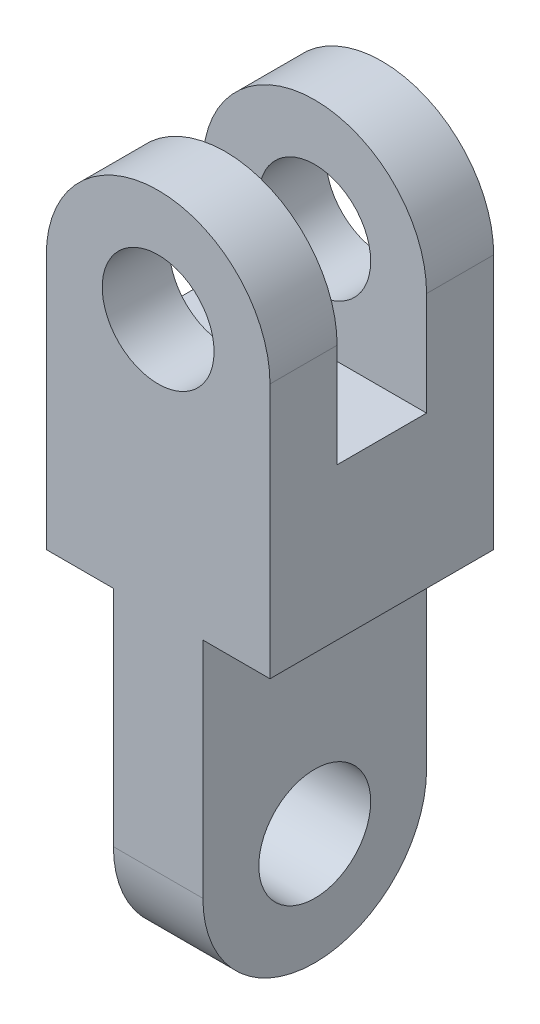
ISO-10303-21;
HEADER;
FILE_DESCRIPTION(('STEP AP214'),'2;1');
FILE_NAME('part.step','',(''),(''),'','','');
FILE_SCHEMA(('AUTOMOTIVE_DESIGN { 1 0 10303 214 1 1 1 1 }'));
ENDSEC;
DATA;
#1=APPLICATION_CONTEXT('core data for automotive mechanical design processes');
#2=APPLICATION_PROTOCOL_DEFINITION('international standard','automotive_design',2000,#1);
#3=PRODUCT_CONTEXT('',#1,'mechanical');
#4=PRODUCT('Part','Part','',(#3));
#5=PRODUCT_RELATED_PRODUCT_CATEGORY('part','',(#4));
#6=PRODUCT_DEFINITION_FORMATION('','',#4);
#7=PRODUCT_DEFINITION_CONTEXT('part definition',#1,'design');
#8=PRODUCT_DEFINITION('design','',#6,#7);
#9=PRODUCT_DEFINITION_SHAPE('','',#8);
#10=(LENGTH_UNIT() NAMED_UNIT(*) SI_UNIT(.MILLI.,.METRE.));
#11=(NAMED_UNIT(*) PLANE_ANGLE_UNIT() SI_UNIT($,.RADIAN.));
#12=(NAMED_UNIT(*) SI_UNIT($,.STERADIAN.) SOLID_ANGLE_UNIT());
#13=UNCERTAINTY_MEASURE_WITH_UNIT(LENGTH_MEASURE(1.E-05),#10,'distance_accuracy_value','');
#14=(GEOMETRIC_REPRESENTATION_CONTEXT(3) GLOBAL_UNCERTAINTY_ASSIGNED_CONTEXT((#13)) GLOBAL_UNIT_ASSIGNED_CONTEXT((#10,
#11,#12)) REPRESENTATION_CONTEXT('',''));
#15=CARTESIAN_POINT('',(0.,0.,0.));
#16=DIRECTION('',(0.,0.,1.));
#17=DIRECTION('',(1.,0.,0.));
#18=AXIS2_PLACEMENT_3D('',#15,#16,#17);
#19=CARTESIAN_POINT('',(0.,114.121621621621,-50.));
#20=DIRECTION('',(0.,0.,1.));
#21=DIRECTION('',(1.,0.,0.));
#22=AXIS2_PLACEMENT_3D('',#19,#20,#21);
#23=CYLINDRICAL_SURFACE('',#22,50.);
#24=CARTESIAN_POINT('',(0.,114.121621621621,-20.));
#25=DIRECTION('',(0.,0.,-1.));
#26=DIRECTION('',(-1.,0.,0.));
#27=AXIS2_PLACEMENT_3D('',#24,#25,#26);
#28=CIRCLE('',#27,50.);
#29=CARTESIAN_POINT('',(50.,114.121621621621,-20.));
#30=VERTEX_POINT('',#29);
#31=CARTESIAN_POINT('',(-50.,114.121621621621,-20.));
#32=VERTEX_POINT('',#31);
#33=EDGE_CURVE('E223',#30,#32,#28,.F.);
#34=ORIENTED_EDGE('',*,*,#33,.F.);
#35=DIRECTION('',(0.,0.,1.));
#36=VECTOR('',#35,1.);
#37=CARTESIAN_POINT('',(50.,114.121621621621,-50.));
#38=LINE('',#37,#36);
#39=CARTESIAN_POINT('',(50.,114.121621621621,-50.));
#40=VERTEX_POINT('',#39);
#41=EDGE_CURVE('E199',#40,#30,#38,.T.);
#42=ORIENTED_EDGE('',*,*,#41,.F.);
#43=CARTESIAN_POINT('',(0.,114.121621621621,-50.));
#44=DIRECTION('',(0.,0.,1.));
#45=DIRECTION('',(1.,0.,0.));
#46=AXIS2_PLACEMENT_3D('',#43,#44,#45);
#47=CIRCLE('',#46,50.);
#48=CARTESIAN_POINT('',(-50.,114.121621621621,-50.));
#49=VERTEX_POINT('',#48);
#50=EDGE_CURVE('E171',#40,#49,#47,.T.);
#51=ORIENTED_EDGE('',*,*,#50,.T.);
#52=DIRECTION('',(0.,0.,1.));
#53=VECTOR('',#52,1.);
#54=CARTESIAN_POINT('',(-50.,114.121621621621,-50.));
#55=LINE('',#54,#53);
#56=EDGE_CURVE('E194',#49,#32,#55,.T.);
#57=ORIENTED_EDGE('',*,*,#56,.T.);
#58=EDGE_LOOP('',(#34,#42,#51,#57));
#59=FACE_BOUND('',#58,.T.);
#60=ADVANCED_FACE('F39',(#59),#23,.T.);
#61=CARTESIAN_POINT('',(20.,-100.,-50.));
#62=DIRECTION('',(1.,0.,0.));
#63=DIRECTION('',(0.,0.,-1.));
#64=AXIS2_PLACEMENT_3D('',#61,#62,#63);
#65=PLANE('',#64);
#66=CARTESIAN_POINT('',(20.,-100.,0.));
#67=DIRECTION('',(1.,0.,0.));
#68=DIRECTION('',(0.,0.,-1.));
#69=AXIS2_PLACEMENT_3D('',#66,#67,#68);
#70=CIRCLE('',#69,25.);
#71=CARTESIAN_POINT('',(20.,-100.,-25.));
#72=VERTEX_POINT('',#71);
#73=EDGE_CURVE('E360',#72,#72,#70,.T.);
#74=ORIENTED_EDGE('',*,*,#73,.F.);
#75=EDGE_LOOP('',(#74));
#76=FACE_BOUND('',#75,.T.);
#77=DIRECTION('',(0.,0.,1.));
#78=VECTOR('',#77,1.);
#79=CARTESIAN_POINT('',(20.,0.,-50.));
#80=LINE('',#79,#78);
#81=CARTESIAN_POINT('',(20.,0.,-50.));
#82=VERTEX_POINT('',#81);
#83=CARTESIAN_POINT('',(20.,0.,50.));
#84=VERTEX_POINT('',#83);
#85=EDGE_CURVE('E188',#82,#84,#80,.T.);
#86=ORIENTED_EDGE('',*,*,#85,.T.);
#87=DIRECTION('',(0.,1.,0.));
#88=VECTOR('',#87,1.);
#89=CARTESIAN_POINT('',(20.,-100.,50.));
#90=LINE('',#89,#88);
#91=CARTESIAN_POINT('',(20.,-100.,50.));
#92=VERTEX_POINT('',#91);
#93=EDGE_CURVE('E210',#92,#84,#90,.T.);
#94=ORIENTED_EDGE('',*,*,#93,.F.);
#95=CARTESIAN_POINT('',(20.,-100.,0.));
#96=DIRECTION('',(-1.,0.,0.));
#97=DIRECTION('',(0.,0.,1.));
#98=AXIS2_PLACEMENT_3D('',#95,#96,#97);
#99=CIRCLE('',#98,50.);
#100=CARTESIAN_POINT('',(20.,-99.9999999999991,-50.));
#101=VERTEX_POINT('',#100);
#102=EDGE_CURVE('E136',#101,#92,#99,.T.);
#103=ORIENTED_EDGE('',*,*,#102,.F.);
#104=DIRECTION('',(0.,1.,0.));
#105=VECTOR('',#104,1.);
#106=CARTESIAN_POINT('',(20.,-100.,-50.));
#107=LINE('',#106,#105);
#108=EDGE_CURVE('E146',#101,#82,#107,.T.);
#109=ORIENTED_EDGE('',*,*,#108,.T.);
#110=EDGE_LOOP('',(#86,#94,#103,#109));
#111=FACE_BOUND('',#110,.T.);
#112=ADVANCED_FACE('F41',(#76,#111),#65,.T.);
#113=CARTESIAN_POINT('',(-20.,0.,-50.));
#114=DIRECTION('',(-1.,0.,0.));
#115=DIRECTION('',(0.,-1.,0.));
#116=AXIS2_PLACEMENT_3D('',#113,#114,#115);
#117=PLANE('',#116);
#118=CARTESIAN_POINT('',(-20.,-100.,0.));
#119=DIRECTION('',(-1.,0.,0.));
#120=DIRECTION('',(0.,-1.,0.));
#121=AXIS2_PLACEMENT_3D('',#118,#119,#120);
#122=CIRCLE('',#121,25.);
#123=CARTESIAN_POINT('',(-20.,-125.,0.));
#124=VERTEX_POINT('',#123);
#125=EDGE_CURVE('E137',#124,#124,#122,.T.);
#126=ORIENTED_EDGE('',*,*,#125,.F.);
#127=EDGE_LOOP('',(#126));
#128=FACE_BOUND('',#127,.T.);
#129=DIRECTION('',(0.,-1.,0.));
#130=VECTOR('',#129,1.);
#131=CARTESIAN_POINT('',(-20.,0.,-50.));
#132=LINE('',#131,#130);
#133=CARTESIAN_POINT('',(-20.,0.,-50.));
#134=VERTEX_POINT('',#133);
#135=CARTESIAN_POINT('',(-20.,-99.9999999999991,-50.));
#136=VERTEX_POINT('',#135);
#137=EDGE_CURVE('E131',#134,#136,#132,.T.);
#138=ORIENTED_EDGE('',*,*,#137,.T.);
#139=CARTESIAN_POINT('',(-20.,-100.,0.));
#140=DIRECTION('',(-1.,0.,0.));
#141=DIRECTION('',(0.,0.,1.));
#142=AXIS2_PLACEMENT_3D('',#139,#140,#141);
#143=CIRCLE('',#142,50.);
#144=CARTESIAN_POINT('',(-20.,-100.,50.));
#145=VERTEX_POINT('',#144);
#146=EDGE_CURVE('E126',#136,#145,#143,.T.);
#147=ORIENTED_EDGE('',*,*,#146,.T.);
#148=DIRECTION('',(0.,-1.,0.));
#149=VECTOR('',#148,1.);
#150=CARTESIAN_POINT('',(-20.,0.,50.));
#151=LINE('',#150,#149);
#152=CARTESIAN_POINT('',(-20.,0.,50.));
#153=VERTEX_POINT('',#152);
#154=EDGE_CURVE('E130',#153,#145,#151,.T.);
#155=ORIENTED_EDGE('',*,*,#154,.F.);
#156=DIRECTION('',(0.,0.,1.));
#157=VECTOR('',#156,1.);
#158=CARTESIAN_POINT('',(-20.,0.,-50.));
#159=LINE('',#158,#157);
#160=EDGE_CURVE('E49',#134,#153,#159,.T.);
#161=ORIENTED_EDGE('',*,*,#160,.F.);
#162=EDGE_LOOP('',(#138,#147,#155,#161));
#163=FACE_BOUND('',#162,.T.);
#164=ADVANCED_FACE('F128',(#128,#163),#117,.T.);
#165=CARTESIAN_POINT('',(-50.,0.,-50.));
#166=DIRECTION('',(0.,-1.,0.));
#167=DIRECTION('',(0.,0.,-1.));
#168=AXIS2_PLACEMENT_3D('',#165,#166,#167);
#169=PLANE('',#168);
#170=ORIENTED_EDGE('',*,*,#160,.T.);
#171=DIRECTION('',(1.,0.,0.));
#172=VECTOR('',#171,1.);
#173=CARTESIAN_POINT('',(-50.,0.,50.));
#174=LINE('',#173,#172);
#175=CARTESIAN_POINT('',(-50.,0.,50.));
#176=VERTEX_POINT('',#175);
#177=EDGE_CURVE('E152',#176,#153,#174,.T.);
#178=ORIENTED_EDGE('',*,*,#177,.F.);
#179=DIRECTION('',(0.,0.,1.));
#180=VECTOR('',#179,1.);
#181=CARTESIAN_POINT('',(-50.,0.,-50.));
#182=LINE('',#181,#180);
#183=CARTESIAN_POINT('',(-50.,0.,-50.));
#184=VERTEX_POINT('',#183);
#185=EDGE_CURVE('E191',#184,#176,#182,.T.);
#186=ORIENTED_EDGE('',*,*,#185,.F.);
#187=DIRECTION('',(1.,0.,0.));
#188=VECTOR('',#187,1.);
#189=CARTESIAN_POINT('',(-50.,0.,-50.));
#190=LINE('',#189,#188);
#191=EDGE_CURVE('E179',#184,#134,#190,.T.);
#192=ORIENTED_EDGE('',*,*,#191,.T.);
#193=EDGE_LOOP('',(#170,#178,#186,#192));
#194=FACE_BOUND('',#193,.T.);
#195=ADVANCED_FACE('F240',(#194),#169,.T.);
#196=CARTESIAN_POINT('',(-50.,114.121621621621,-50.));
#197=DIRECTION('',(-1.,0.,0.));
#198=DIRECTION('',(0.,-1.,0.));
#199=AXIS2_PLACEMENT_3D('',#196,#197,#198);
#200=PLANE('',#199);
#201=DIRECTION('',(0.,1.,0.));
#202=VECTOR('',#201,1.);
#203=CARTESIAN_POINT('',(-50.,67.8478847164321,-20.));
#204=LINE('',#203,#202);
#205=CARTESIAN_POINT('',(-50.,67.8478847164321,-20.));
#206=VERTEX_POINT('',#205);
#207=EDGE_CURVE('E250',#206,#32,#204,.T.);
#208=ORIENTED_EDGE('',*,*,#207,.T.);
#209=ORIENTED_EDGE('',*,*,#56,.F.);
#210=DIRECTION('',(0.,-1.,0.));
#211=VECTOR('',#210,1.);
#212=CARTESIAN_POINT('',(-50.,114.121621621621,-50.));
#213=LINE('',#212,#211);
#214=EDGE_CURVE('E175',#49,#184,#213,.T.);
#215=ORIENTED_EDGE('',*,*,#214,.T.);
#216=ORIENTED_EDGE('',*,*,#185,.T.);
#217=DIRECTION('',(0.,-1.,0.));
#218=VECTOR('',#217,1.);
#219=CARTESIAN_POINT('',(-50.,114.121621621621,50.));
#220=LINE('',#219,#218);
#221=CARTESIAN_POINT('',(-50.,114.121621621621,50.));
#222=VERTEX_POINT('',#221);
#223=EDGE_CURVE('E156',#222,#176,#220,.T.);
#224=ORIENTED_EDGE('',*,*,#223,.F.);
#225=CARTESIAN_POINT('',(-50.,114.121621621621,20.));
#226=VERTEX_POINT('',#225);
#227=EDGE_CURVE('E198',#226,#222,#55,.T.);
#228=ORIENTED_EDGE('',*,*,#227,.F.);
#229=DIRECTION('',(0.,-1.,0.));
#230=VECTOR('',#229,1.);
#231=CARTESIAN_POINT('',(-50.,168.662891807038,20.));
#232=LINE('',#231,#230);
#233=CARTESIAN_POINT('',(-50.,67.8478847164321,20.));
#234=VERTEX_POINT('',#233);
#235=EDGE_CURVE('E263',#226,#234,#232,.T.);
#236=ORIENTED_EDGE('',*,*,#235,.T.);
#237=DIRECTION('',(0.,0.,-1.));
#238=VECTOR('',#237,1.);
#239=CARTESIAN_POINT('',(-50.,67.8478847164321,20.));
#240=LINE('',#239,#238);
#241=EDGE_CURVE('E265',#234,#206,#240,.T.);
#242=ORIENTED_EDGE('',*,*,#241,.T.);
#243=EDGE_LOOP('',(#208,#209,#215,#216,#224,#228,#236,#242));
#244=FACE_BOUND('',#243,.T.);
#245=ADVANCED_FACE('F247',(#244),#200,.T.);
#246=CARTESIAN_POINT('',(0.,114.121621621621,20.));
#247=DIRECTION('',(0.,0.,1.));
#248=DIRECTION('',(0.,-1.,0.));
#249=AXIS2_PLACEMENT_3D('',#246,#247,#248);
#250=CIRCLE('',#249,50.);
#251=CARTESIAN_POINT('',(50.,114.121621621621,20.));
#252=VERTEX_POINT('',#251);
#253=EDGE_CURVE('E55',#226,#252,#250,.F.);
#254=ORIENTED_EDGE('',*,*,#253,.F.);
#255=ORIENTED_EDGE('',*,*,#227,.T.);
#256=CARTESIAN_POINT('',(0.,114.121621621621,50.));
#257=DIRECTION('',(0.,0.,1.));
#258=DIRECTION('',(1.,0.,0.));
#259=AXIS2_PLACEMENT_3D('',#256,#257,#258);
#260=CIRCLE('',#259,50.);
#261=CARTESIAN_POINT('',(50.,114.121621621621,50.));
#262=VERTEX_POINT('',#261);
#263=EDGE_CURVE('E231',#262,#222,#260,.T.);
#264=ORIENTED_EDGE('',*,*,#263,.F.);
#265=EDGE_CURVE('E203',#252,#262,#38,.T.);
#266=ORIENTED_EDGE('',*,*,#265,.F.);
#267=EDGE_LOOP('',(#254,#255,#264,#266));
#268=FACE_BOUND('',#267,.T.);
#269=ADVANCED_FACE('F259',(#268),#23,.T.);
#270=CARTESIAN_POINT('',(50.,0.,-50.));
#271=DIRECTION('',(1.,0.,0.));
#272=DIRECTION('',(0.,1.,0.));
#273=AXIS2_PLACEMENT_3D('',#270,#271,#272);
#274=PLANE('',#273);
#275=DIRECTION('',(0.,1.,0.));
#276=VECTOR('',#275,1.);
#277=CARTESIAN_POINT('',(50.,67.8478847164321,-20.));
#278=LINE('',#277,#276);
#279=CARTESIAN_POINT('',(50.,67.8478847164321,-20.));
#280=VERTEX_POINT('',#279);
#281=EDGE_CURVE('E267',#280,#30,#278,.T.);
#282=ORIENTED_EDGE('',*,*,#281,.F.);
#283=DIRECTION('',(0.,0.,-1.));
#284=VECTOR('',#283,1.);
#285=CARTESIAN_POINT('',(50.,67.8478847164321,20.));
#286=LINE('',#285,#284);
#287=CARTESIAN_POINT('',(50.,67.8478847164321,20.));
#288=VERTEX_POINT('',#287);
#289=EDGE_CURVE('E272',#288,#280,#286,.T.);
#290=ORIENTED_EDGE('',*,*,#289,.F.);
#291=DIRECTION('',(0.,-1.,0.));
#292=VECTOR('',#291,1.);
#293=CARTESIAN_POINT('',(50.,0.,20.));
#294=LINE('',#293,#292);
#295=EDGE_CURVE('E11',#252,#288,#294,.T.);
#296=ORIENTED_EDGE('',*,*,#295,.F.);
#297=ORIENTED_EDGE('',*,*,#265,.T.);
#298=DIRECTION('',(0.,1.,0.));
#299=VECTOR('',#298,1.);
#300=CARTESIAN_POINT('',(50.,0.,50.));
#301=LINE('',#300,#299);
#302=CARTESIAN_POINT('',(50.,0.,50.));
#303=VERTEX_POINT('',#302);
#304=EDGE_CURVE('E220',#303,#262,#301,.T.);
#305=ORIENTED_EDGE('',*,*,#304,.F.);
#306=DIRECTION('',(0.,0.,1.));
#307=VECTOR('',#306,1.);
#308=CARTESIAN_POINT('',(50.,0.,-50.));
#309=LINE('',#308,#307);
#310=CARTESIAN_POINT('',(50.,0.,-50.));
#311=VERTEX_POINT('',#310);
#312=EDGE_CURVE('E204',#311,#303,#309,.T.);
#313=ORIENTED_EDGE('',*,*,#312,.F.);
#314=DIRECTION('',(0.,1.,0.));
#315=VECTOR('',#314,1.);
#316=CARTESIAN_POINT('',(50.,0.,-50.));
#317=LINE('',#316,#315);
#318=EDGE_CURVE('E167',#311,#40,#317,.T.);
#319=ORIENTED_EDGE('',*,*,#318,.T.);
#320=ORIENTED_EDGE('',*,*,#41,.T.);
#321=EDGE_LOOP('',(#282,#290,#296,#297,#305,#313,#319,#320));
#322=FACE_BOUND('',#321,.T.);
#323=ADVANCED_FACE('F256',(#322),#274,.T.);
#324=CARTESIAN_POINT('',(20.,0.,-50.));
#325=DIRECTION('',(0.,-1.,0.));
#326=DIRECTION('',(0.,0.,-1.));
#327=AXIS2_PLACEMENT_3D('',#324,#325,#326);
#328=PLANE('',#327);
#329=ORIENTED_EDGE('',*,*,#312,.T.);
#330=DIRECTION('',(1.,0.,0.));
#331=VECTOR('',#330,1.);
#332=CARTESIAN_POINT('',(20.,0.,50.));
#333=LINE('',#332,#331);
#334=EDGE_CURVE('E215',#84,#303,#333,.T.);
#335=ORIENTED_EDGE('',*,*,#334,.F.);
#336=ORIENTED_EDGE('',*,*,#85,.F.);
#337=DIRECTION('',(1.,0.,0.));
#338=VECTOR('',#337,1.);
#339=CARTESIAN_POINT('',(20.,0.,-50.));
#340=LINE('',#339,#338);
#341=EDGE_CURVE('E163',#82,#311,#340,.T.);
#342=ORIENTED_EDGE('',*,*,#341,.T.);
#343=EDGE_LOOP('',(#329,#335,#336,#342));
#344=FACE_BOUND('',#343,.T.);
#345=ADVANCED_FACE('F216',(#344),#328,.T.);
#346=CARTESIAN_POINT('',(0.,114.121621621621,-50.));
#347=DIRECTION('',(0.,0.,1.));
#348=DIRECTION('',(1.,0.,0.));
#349=AXIS2_PLACEMENT_3D('',#346,#347,#348);
#350=PLANE('',#349);
#351=CARTESIAN_POINT('',(0.,114.121621621621,-50.));
#352=DIRECTION('',(0.,0.,1.));
#353=DIRECTION('',(1.,0.,0.));
#354=AXIS2_PLACEMENT_3D('',#351,#352,#353);
#355=CIRCLE('',#354,25.);
#356=CARTESIAN_POINT('',(25.,114.121621621621,-50.));
#357=VERTEX_POINT('',#356);
#358=EDGE_CURVE('E345',#357,#357,#355,.T.);
#359=ORIENTED_EDGE('',*,*,#358,.T.);
#360=EDGE_LOOP('',(#359));
#361=FACE_BOUND('',#360,.T.);
#362=ORIENTED_EDGE('',*,*,#108,.F.);
#363=DIRECTION('',(1.,0.,0.));
#364=VECTOR('',#363,1.);
#365=CARTESIAN_POINT('',(-20.,-100.,-50.));
#366=LINE('',#365,#364);
#367=EDGE_CURVE('E185',#136,#101,#366,.T.);
#368=ORIENTED_EDGE('',*,*,#367,.F.);
#369=ORIENTED_EDGE('',*,*,#137,.F.);
#370=ORIENTED_EDGE('',*,*,#191,.F.);
#371=ORIENTED_EDGE('',*,*,#214,.F.);
#372=ORIENTED_EDGE('',*,*,#50,.F.);
#373=ORIENTED_EDGE('',*,*,#318,.F.);
#374=ORIENTED_EDGE('',*,*,#341,.F.);
#375=EDGE_LOOP('',(#362,#368,#369,#370,#371,#372,#373,#374));
#376=FACE_BOUND('',#375,.T.);
#377=ADVANCED_FACE('F244',(#361,#376),#350,.F.);
#378=CARTESIAN_POINT('',(0.,114.121621621621,50.));
#379=DIRECTION('',(0.,0.,1.));
#380=DIRECTION('',(1.,0.,0.));
#381=AXIS2_PLACEMENT_3D('',#378,#379,#380);
#382=PLANE('',#381);
#383=CARTESIAN_POINT('',(0.,114.121621621621,50.));
#384=DIRECTION('',(0.,0.,1.));
#385=DIRECTION('',(1.,0.,0.));
#386=AXIS2_PLACEMENT_3D('',#383,#384,#385);
#387=CIRCLE('',#386,25.);
#388=CARTESIAN_POINT('',(25.,114.121621621621,50.));
#389=VERTEX_POINT('',#388);
#390=EDGE_CURVE('E349',#389,#389,#387,.T.);
#391=ORIENTED_EDGE('',*,*,#390,.F.);
#392=EDGE_LOOP('',(#391));
#393=FACE_BOUND('',#392,.T.);
#394=ORIENTED_EDGE('',*,*,#93,.T.);
#395=ORIENTED_EDGE('',*,*,#334,.T.);
#396=ORIENTED_EDGE('',*,*,#304,.T.);
#397=ORIENTED_EDGE('',*,*,#263,.T.);
#398=ORIENTED_EDGE('',*,*,#223,.T.);
#399=ORIENTED_EDGE('',*,*,#177,.T.);
#400=ORIENTED_EDGE('',*,*,#154,.T.);
#401=DIRECTION('',(1.,0.,0.));
#402=VECTOR('',#401,1.);
#403=CARTESIAN_POINT('',(-20.,-100.,50.));
#404=LINE('',#403,#402);
#405=EDGE_CURVE('E140',#145,#92,#404,.T.);
#406=ORIENTED_EDGE('',*,*,#405,.T.);
#407=EDGE_LOOP('',(#394,#395,#396,#397,#398,#399,#400,#406));
#408=FACE_BOUND('',#407,.T.);
#409=ADVANCED_FACE('F149',(#393,#408),#382,.T.);
#410=CARTESIAN_POINT('',(-50.,67.8478847164321,-20.));
#411=DIRECTION('',(0.,0.,-1.));
#412=DIRECTION('',(-1.,0.,0.));
#413=AXIS2_PLACEMENT_3D('',#410,#411,#412);
#414=PLANE('',#413);
#415=CARTESIAN_POINT('',(0.,114.121621621621,-20.));
#416=DIRECTION('',(0.,0.,-1.));
#417=DIRECTION('',(-1.,0.,0.));
#418=AXIS2_PLACEMENT_3D('',#415,#416,#417);
#419=CIRCLE('',#418,25.);
#420=CARTESIAN_POINT('',(-25.,114.121621621621,-20.));
#421=VERTEX_POINT('',#420);
#422=EDGE_CURVE('E43',#421,#421,#419,.T.);
#423=ORIENTED_EDGE('',*,*,#422,.T.);
#424=EDGE_LOOP('',(#423));
#425=FACE_BOUND('',#424,.T.);
#426=ORIENTED_EDGE('',*,*,#33,.T.);
#427=ORIENTED_EDGE('',*,*,#207,.F.);
#428=DIRECTION('',(1.,0.,0.));
#429=VECTOR('',#428,1.);
#430=CARTESIAN_POINT('',(-50.,67.8478847164321,-20.));
#431=LINE('',#430,#429);
#432=EDGE_CURVE('E284',#206,#280,#431,.T.);
#433=ORIENTED_EDGE('',*,*,#432,.T.);
#434=ORIENTED_EDGE('',*,*,#281,.T.);
#435=EDGE_LOOP('',(#426,#427,#433,#434));
#436=FACE_BOUND('',#435,.T.);
#437=ADVANCED_FACE('F294',(#425,#436),#414,.F.);
#438=CARTESIAN_POINT('',(-50.,67.8478847164321,20.));
#439=DIRECTION('',(0.,-1.,0.));
#440=DIRECTION('',(1.,0.,0.));
#441=AXIS2_PLACEMENT_3D('',#438,#439,#440);
#442=PLANE('',#441);
#443=ORIENTED_EDGE('',*,*,#289,.T.);
#444=ORIENTED_EDGE('',*,*,#432,.F.);
#445=ORIENTED_EDGE('',*,*,#241,.F.);
#446=DIRECTION('',(1.,0.,0.));
#447=VECTOR('',#446,1.);
#448=CARTESIAN_POINT('',(-50.,67.8478847164321,20.));
#449=LINE('',#448,#447);
#450=EDGE_CURVE('E280',#234,#288,#449,.T.);
#451=ORIENTED_EDGE('',*,*,#450,.T.);
#452=EDGE_LOOP('',(#443,#444,#445,#451));
#453=FACE_BOUND('',#452,.T.);
#454=ADVANCED_FACE('F292',(#453),#442,.F.);
#455=CARTESIAN_POINT('',(-50.,114.121621621621,20.));
#456=DIRECTION('',(0.,0.,1.));
#457=DIRECTION('',(0.,-1.,0.));
#458=AXIS2_PLACEMENT_3D('',#455,#456,#457);
#459=PLANE('',#458);
#460=CARTESIAN_POINT('',(0.,114.121621621621,20.));
#461=DIRECTION('',(0.,0.,1.));
#462=DIRECTION('',(0.,-1.,0.));
#463=AXIS2_PLACEMENT_3D('',#460,#461,#462);
#464=CIRCLE('',#463,25.);
#465=CARTESIAN_POINT('',(0.,89.1216216216215,20.));
#466=VERTEX_POINT('',#465);
#467=EDGE_CURVE('E275',#466,#466,#464,.T.);
#468=ORIENTED_EDGE('',*,*,#467,.T.);
#469=EDGE_LOOP('',(#468));
#470=FACE_BOUND('',#469,.T.);
#471=ORIENTED_EDGE('',*,*,#253,.T.);
#472=ORIENTED_EDGE('',*,*,#295,.T.);
#473=ORIENTED_EDGE('',*,*,#450,.F.);
#474=ORIENTED_EDGE('',*,*,#235,.F.);
#475=EDGE_LOOP('',(#471,#472,#473,#474));
#476=FACE_BOUND('',#475,.T.);
#477=ADVANCED_FACE('F302',(#470,#476),#459,.F.);
#478=CARTESIAN_POINT('',(0.,114.121621621621,50.));
#479=DIRECTION('',(0.,0.,1.));
#480=DIRECTION('',(1.,0.,0.));
#481=AXIS2_PLACEMENT_3D('',#478,#479,#480);
#482=CYLINDRICAL_SURFACE('',#481,25.);
#483=ORIENTED_EDGE('',*,*,#358,.F.);
#484=EDGE_LOOP('',(#483));
#485=FACE_BOUND('',#484,.T.);
#486=ORIENTED_EDGE('',*,*,#422,.F.);
#487=EDGE_LOOP('',(#486));
#488=FACE_BOUND('',#487,.T.);
#489=ADVANCED_FACE('F333',(#485,#488),#482,.F.);
#490=ORIENTED_EDGE('',*,*,#390,.T.);
#491=EDGE_LOOP('',(#490));
#492=FACE_BOUND('',#491,.T.);
#493=ORIENTED_EDGE('',*,*,#467,.F.);
#494=EDGE_LOOP('',(#493));
#495=FACE_BOUND('',#494,.T.);
#496=ADVANCED_FACE('F338',(#492,#495),#482,.F.);
#497=CARTESIAN_POINT('',(20.,-100.,0.));
#498=DIRECTION('',(-1.,0.,0.));
#499=DIRECTION('',(0.,0.,1.));
#500=AXIS2_PLACEMENT_3D('',#497,#498,#499);
#501=CYLINDRICAL_SURFACE('',#500,50.);
#502=ORIENTED_EDGE('',*,*,#102,.T.);
#503=ORIENTED_EDGE('',*,*,#405,.F.);
#504=ORIENTED_EDGE('',*,*,#146,.F.);
#505=ORIENTED_EDGE('',*,*,#367,.T.);
#506=EDGE_LOOP('',(#502,#503,#504,#505));
#507=FACE_BOUND('',#506,.T.);
#508=ADVANCED_FACE('F141',(#507),#501,.T.);
#509=CARTESIAN_POINT('',(20.,-100.,0.));
#510=DIRECTION('',(1.,0.,0.));
#511=DIRECTION('',(0.,0.,-1.));
#512=AXIS2_PLACEMENT_3D('',#509,#510,#511);
#513=CYLINDRICAL_SURFACE('',#512,25.);
#514=ORIENTED_EDGE('',*,*,#125,.T.);
#515=EDGE_LOOP('',(#514));
#516=FACE_BOUND('',#515,.T.);
#517=ORIENTED_EDGE('',*,*,#73,.T.);
#518=EDGE_LOOP('',(#517));
#519=FACE_BOUND('',#518,.T.);
#520=ADVANCED_FACE('F365',(#516,#519),#513,.F.);
#521=CLOSED_SHELL('',(#60,#112,#164,#195,#245,#269,#323,#345,#377,#409,#437,#454,#477,#489,#496,
#508,#520));
#522=MANIFOLD_SOLID_BREP('B2',#521);
#523=ADVANCED_BREP_SHAPE_REPRESENTATION('',(#18,#522),#14);
#524=SHAPE_DEFINITION_REPRESENTATION(#9,#523);
ENDSEC;
END-ISO-10303-21;
